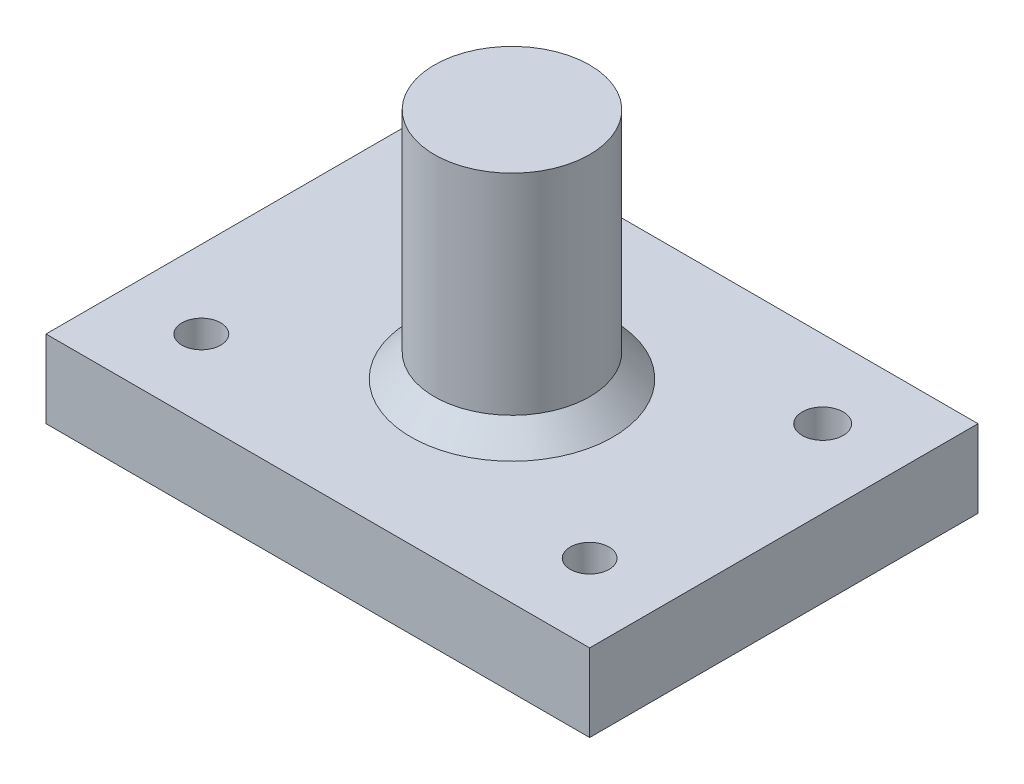
ISO-10303-21;
HEADER;
FILE_DESCRIPTION(('STEP AP214'),'2;1');
FILE_NAME('part.step','',(''),(''),'','','');
FILE_SCHEMA(('AUTOMOTIVE_DESIGN { 1 0 10303 214 1 1 1 1 }'));
ENDSEC;
DATA;
#1=APPLICATION_CONTEXT('core data for automotive mechanical design processes');
#2=APPLICATION_PROTOCOL_DEFINITION('international standard','automotive_design',2000,#1);
#3=PRODUCT_CONTEXT('',#1,'mechanical');
#4=PRODUCT('Part','Part','',(#3));
#5=PRODUCT_RELATED_PRODUCT_CATEGORY('part','',(#4));
#6=PRODUCT_DEFINITION_FORMATION('','',#4);
#7=PRODUCT_DEFINITION_CONTEXT('part definition',#1,'design');
#8=PRODUCT_DEFINITION('design','',#6,#7);
#9=PRODUCT_DEFINITION_SHAPE('','',#8);
#10=(LENGTH_UNIT() NAMED_UNIT(*) SI_UNIT(.MILLI.,.METRE.));
#11=(NAMED_UNIT(*) PLANE_ANGLE_UNIT() SI_UNIT($,.RADIAN.));
#12=(NAMED_UNIT(*) SI_UNIT($,.STERADIAN.) SOLID_ANGLE_UNIT());
#13=UNCERTAINTY_MEASURE_WITH_UNIT(LENGTH_MEASURE(1.E-05),#10,'distance_accuracy_value','');
#14=(GEOMETRIC_REPRESENTATION_CONTEXT(3) GLOBAL_UNCERTAINTY_ASSIGNED_CONTEXT((#13)) GLOBAL_UNIT_ASSIGNED_CONTEXT((#10,
#11,#12)) REPRESENTATION_CONTEXT('',''));
#15=CARTESIAN_POINT('',(0.,0.,0.));
#16=DIRECTION('',(0.,0.,1.));
#17=DIRECTION('',(1.,0.,0.));
#18=AXIS2_PLACEMENT_3D('',#15,#16,#17);
#19=CARTESIAN_POINT('',(0.,12.7,0.));
#20=DIRECTION('',(0.,-1.,0.));
#21=DIRECTION('',(0.,0.,-1.));
#22=AXIS2_PLACEMENT_3D('',#19,#20,#21);
#23=PLANE('',#22);
#24=CARTESIAN_POINT('',(0.,12.7,0.));
#25=DIRECTION('',(0.,-1.,0.));
#26=DIRECTION('',(0.,0.,-1.));
#27=AXIS2_PLACEMENT_3D('',#24,#25,#26);
#28=CIRCLE('',#27,16.5100000000001);
#29=CARTESIAN_POINT('',(0.,12.7,-16.5100000000001));
#30=VERTEX_POINT('',#29);
#31=EDGE_CURVE('E11',#30,#30,#28,.T.);
#32=ORIENTED_EDGE('',*,*,#31,.T.);
#33=EDGE_LOOP('',(#32));
#34=FACE_BOUND('',#33,.T.);
#35=DIRECTION('',(0.,0.,-1.));
#36=VECTOR('',#35,1.);
#37=CARTESIAN_POINT('',(44.45,12.7,31.75));
#38=LINE('',#37,#36);
#39=CARTESIAN_POINT('',(44.45,12.7,31.75));
#40=VERTEX_POINT('',#39);
#41=CARTESIAN_POINT('',(44.45,12.7,-31.75));
#42=VERTEX_POINT('',#41);
#43=EDGE_CURVE('E86',#40,#42,#38,.T.);
#44=ORIENTED_EDGE('',*,*,#43,.T.);
#45=DIRECTION('',(-1.,0.,0.));
#46=VECTOR('',#45,1.);
#47=CARTESIAN_POINT('',(-44.45,12.7,-31.75));
#48=LINE('',#47,#46);
#49=CARTESIAN_POINT('',(-44.45,12.7,-31.75));
#50=VERTEX_POINT('',#49);
#51=EDGE_CURVE('E81',#42,#50,#48,.T.);
#52=ORIENTED_EDGE('',*,*,#51,.T.);
#53=DIRECTION('',(0.,0.,1.));
#54=VECTOR('',#53,1.);
#55=CARTESIAN_POINT('',(-44.45,12.7,31.75));
#56=LINE('',#55,#54);
#57=CARTESIAN_POINT('',(-44.45,12.7,31.75));
#58=VERTEX_POINT('',#57);
#59=EDGE_CURVE('E84',#50,#58,#56,.T.);
#60=ORIENTED_EDGE('',*,*,#59,.T.);
#61=DIRECTION('',(1.,0.,0.));
#62=VECTOR('',#61,1.);
#63=CARTESIAN_POINT('',(-44.45,12.7,31.75));
#64=LINE('',#63,#62);
#65=EDGE_CURVE('E50',#58,#40,#64,.T.);
#66=ORIENTED_EDGE('',*,*,#65,.T.);
#67=EDGE_LOOP('',(#44,#52,#60,#66));
#68=FACE_BOUND('',#67,.T.);
#69=CARTESIAN_POINT('',(-31.75,12.7,19.05));
#70=DIRECTION('',(0.,1.,0.));
#71=DIRECTION('',(0.,0.,1.));
#72=AXIS2_PLACEMENT_3D('',#69,#70,#71);
#73=CIRCLE('',#72,3.175);
#74=CARTESIAN_POINT('',(-31.75,12.7,22.225));
#75=VERTEX_POINT('',#74);
#76=EDGE_CURVE('E104',#75,#75,#73,.T.);
#77=ORIENTED_EDGE('',*,*,#76,.F.);
#78=EDGE_LOOP('',(#77));
#79=FACE_BOUND('',#78,.T.);
#80=CARTESIAN_POINT('',(-31.75,12.7,-19.05));
#81=DIRECTION('',(0.,1.,0.));
#82=DIRECTION('',(0.,0.,1.));
#83=AXIS2_PLACEMENT_3D('',#80,#81,#82);
#84=CIRCLE('',#83,3.175);
#85=CARTESIAN_POINT('',(-31.75,12.7,-15.875));
#86=VERTEX_POINT('',#85);
#87=EDGE_CURVE('E174',#86,#86,#84,.T.);
#88=ORIENTED_EDGE('',*,*,#87,.F.);
#89=EDGE_LOOP('',(#88));
#90=FACE_BOUND('',#89,.T.);
#91=CARTESIAN_POINT('',(31.75,12.7,19.05));
#92=DIRECTION('',(0.,1.,0.));
#93=DIRECTION('',(0.,0.,1.));
#94=AXIS2_PLACEMENT_3D('',#91,#92,#93);
#95=CIRCLE('',#94,3.175);
#96=CARTESIAN_POINT('',(31.75,12.7,22.225));
#97=VERTEX_POINT('',#96);
#98=EDGE_CURVE('E169',#97,#97,#95,.T.);
#99=ORIENTED_EDGE('',*,*,#98,.F.);
#100=EDGE_LOOP('',(#99));
#101=FACE_BOUND('',#100,.T.);
#102=CARTESIAN_POINT('',(31.75,12.7,-19.05));
#103=DIRECTION('',(0.,1.,0.));
#104=DIRECTION('',(0.,0.,1.));
#105=AXIS2_PLACEMENT_3D('',#102,#103,#104);
#106=CIRCLE('',#105,3.34923459708312);
#107=CARTESIAN_POINT('',(31.75,12.7,-15.7007654029169));
#108=VERTEX_POINT('',#107);
#109=EDGE_CURVE('E160',#108,#108,#106,.T.);
#110=ORIENTED_EDGE('',*,*,#109,.F.);
#111=EDGE_LOOP('',(#110));
#112=FACE_BOUND('',#111,.T.);
#113=ADVANCED_FACE('F33',(#34,#68,#79,#90,#101,#112),#23,.F.);
#114=CARTESIAN_POINT('',(0.,0.,0.));
#115=DIRECTION('',(0.,-1.,0.));
#116=DIRECTION('',(0.,0.,-1.));
#117=AXIS2_PLACEMENT_3D('',#114,#115,#116);
#118=PLANE('',#117);
#119=CARTESIAN_POINT('',(31.75,0.,19.05));
#120=DIRECTION('',(0.,1.,0.));
#121=DIRECTION('',(0.,0.,1.));
#122=AXIS2_PLACEMENT_3D('',#119,#120,#121);
#123=CIRCLE('',#122,3.175);
#124=CARTESIAN_POINT('',(31.75,0.,22.225));
#125=VERTEX_POINT('',#124);
#126=EDGE_CURVE('E164',#125,#125,#123,.T.);
#127=ORIENTED_EDGE('',*,*,#126,.T.);
#128=EDGE_LOOP('',(#127));
#129=FACE_BOUND('',#128,.T.);
#130=CARTESIAN_POINT('',(-31.75,0.,19.05));
#131=DIRECTION('',(0.,1.,0.));
#132=DIRECTION('',(0.,0.,1.));
#133=AXIS2_PLACEMENT_3D('',#130,#131,#132);
#134=CIRCLE('',#133,3.175);
#135=CARTESIAN_POINT('',(-31.75,0.,22.225));
#136=VERTEX_POINT('',#135);
#137=EDGE_CURVE('E177',#136,#136,#134,.T.);
#138=ORIENTED_EDGE('',*,*,#137,.T.);
#139=EDGE_LOOP('',(#138));
#140=FACE_BOUND('',#139,.T.);
#141=DIRECTION('',(0.,0.,-1.));
#142=VECTOR('',#141,1.);
#143=CARTESIAN_POINT('',(44.45,0.,31.75));
#144=LINE('',#143,#142);
#145=CARTESIAN_POINT('',(44.45,0.,31.75));
#146=VERTEX_POINT('',#145);
#147=CARTESIAN_POINT('',(44.45,0.,-31.75));
#148=VERTEX_POINT('',#147);
#149=EDGE_CURVE('E101',#146,#148,#144,.T.);
#150=ORIENTED_EDGE('',*,*,#149,.F.);
#151=DIRECTION('',(1.,0.,0.));
#152=VECTOR('',#151,1.);
#153=CARTESIAN_POINT('',(-44.45,0.,31.75));
#154=LINE('',#153,#152);
#155=CARTESIAN_POINT('',(-44.45,0.,31.75));
#156=VERTEX_POINT('',#155);
#157=EDGE_CURVE('E73',#156,#146,#154,.T.);
#158=ORIENTED_EDGE('',*,*,#157,.F.);
#159=DIRECTION('',(0.,0.,1.));
#160=VECTOR('',#159,1.);
#161=CARTESIAN_POINT('',(-44.45,0.,31.75));
#162=LINE('',#161,#160);
#163=CARTESIAN_POINT('',(-44.45,0.,-31.75));
#164=VERTEX_POINT('',#163);
#165=EDGE_CURVE('E67',#164,#156,#162,.T.);
#166=ORIENTED_EDGE('',*,*,#165,.F.);
#167=DIRECTION('',(-1.,0.,0.));
#168=VECTOR('',#167,1.);
#169=CARTESIAN_POINT('',(-44.45,0.,-31.75));
#170=LINE('',#169,#168);
#171=EDGE_CURVE('E91',#148,#164,#170,.T.);
#172=ORIENTED_EDGE('',*,*,#171,.F.);
#173=EDGE_LOOP('',(#150,#158,#166,#172));
#174=FACE_BOUND('',#173,.T.);
#175=CARTESIAN_POINT('',(-31.75,0.,-19.05));
#176=DIRECTION('',(0.,1.,0.));
#177=DIRECTION('',(0.,0.,1.));
#178=AXIS2_PLACEMENT_3D('',#175,#176,#177);
#179=CIRCLE('',#178,3.175);
#180=CARTESIAN_POINT('',(-31.75,0.,-15.875));
#181=VERTEX_POINT('',#180);
#182=EDGE_CURVE('E155',#181,#181,#179,.T.);
#183=ORIENTED_EDGE('',*,*,#182,.T.);
#184=EDGE_LOOP('',(#183));
#185=FACE_BOUND('',#184,.T.);
#186=CARTESIAN_POINT('',(31.75,0.,-19.05));
#187=DIRECTION('',(0.,1.,0.));
#188=DIRECTION('',(0.,0.,1.));
#189=AXIS2_PLACEMENT_3D('',#186,#187,#188);
#190=CIRCLE('',#189,3.34923459708312);
#191=CARTESIAN_POINT('',(31.75,0.,-15.7007654029169));
#192=VERTEX_POINT('',#191);
#193=EDGE_CURVE('E158',#192,#192,#190,.T.);
#194=ORIENTED_EDGE('',*,*,#193,.T.);
#195=EDGE_LOOP('',(#194));
#196=FACE_BOUND('',#195,.T.);
#197=ADVANCED_FACE('F126',(#129,#140,#174,#185,#196),#118,.T.);
#198=CARTESIAN_POINT('',(44.45,12.7,31.75));
#199=DIRECTION('',(-1.,0.,0.));
#200=DIRECTION('',(0.,0.,1.));
#201=AXIS2_PLACEMENT_3D('',#198,#199,#200);
#202=PLANE('',#201);
#203=ORIENTED_EDGE('',*,*,#149,.T.);
#204=DIRECTION('',(0.,-1.,0.));
#205=VECTOR('',#204,1.);
#206=CARTESIAN_POINT('',(44.45,12.7,-31.75));
#207=LINE('',#206,#205);
#208=EDGE_CURVE('E92',#42,#148,#207,.T.);
#209=ORIENTED_EDGE('',*,*,#208,.F.);
#210=ORIENTED_EDGE('',*,*,#43,.F.);
#211=DIRECTION('',(0.,-1.,0.));
#212=VECTOR('',#211,1.);
#213=CARTESIAN_POINT('',(44.45,12.7,31.75));
#214=LINE('',#213,#212);
#215=EDGE_CURVE('E97',#40,#146,#214,.T.);
#216=ORIENTED_EDGE('',*,*,#215,.T.);
#217=EDGE_LOOP('',(#203,#209,#210,#216));
#218=FACE_BOUND('',#217,.T.);
#219=ADVANCED_FACE('F132',(#218),#202,.F.);
#220=CARTESIAN_POINT('',(-44.45,12.7,-31.75));
#221=DIRECTION('',(0.,0.,1.));
#222=DIRECTION('',(1.,0.,0.));
#223=AXIS2_PLACEMENT_3D('',#220,#221,#222);
#224=PLANE('',#223);
#225=ORIENTED_EDGE('',*,*,#171,.T.);
#226=DIRECTION('',(0.,-1.,0.));
#227=VECTOR('',#226,1.);
#228=CARTESIAN_POINT('',(-44.45,12.7,-31.75));
#229=LINE('',#228,#227);
#230=EDGE_CURVE('E89',#50,#164,#229,.T.);
#231=ORIENTED_EDGE('',*,*,#230,.F.);
#232=ORIENTED_EDGE('',*,*,#51,.F.);
#233=ORIENTED_EDGE('',*,*,#208,.T.);
#234=EDGE_LOOP('',(#225,#231,#232,#233));
#235=FACE_BOUND('',#234,.T.);
#236=ADVANCED_FACE('F90',(#235),#224,.F.);
#237=CARTESIAN_POINT('',(-44.45,12.7,31.75));
#238=DIRECTION('',(1.,0.,0.));
#239=DIRECTION('',(0.,0.,-1.));
#240=AXIS2_PLACEMENT_3D('',#237,#238,#239);
#241=PLANE('',#240);
#242=ORIENTED_EDGE('',*,*,#165,.T.);
#243=DIRECTION('',(0.,-1.,0.));
#244=VECTOR('',#243,1.);
#245=CARTESIAN_POINT('',(-44.45,12.7,31.75));
#246=LINE('',#245,#244);
#247=EDGE_CURVE('E93',#58,#156,#246,.T.);
#248=ORIENTED_EDGE('',*,*,#247,.F.);
#249=ORIENTED_EDGE('',*,*,#59,.F.);
#250=ORIENTED_EDGE('',*,*,#230,.T.);
#251=EDGE_LOOP('',(#242,#248,#249,#250));
#252=FACE_BOUND('',#251,.T.);
#253=ADVANCED_FACE('F95',(#252),#241,.F.);
#254=CARTESIAN_POINT('',(-44.45,12.7,31.75));
#255=DIRECTION('',(0.,0.,-1.));
#256=DIRECTION('',(-1.,0.,0.));
#257=AXIS2_PLACEMENT_3D('',#254,#255,#256);
#258=PLANE('',#257);
#259=ORIENTED_EDGE('',*,*,#157,.T.);
#260=ORIENTED_EDGE('',*,*,#215,.F.);
#261=ORIENTED_EDGE('',*,*,#65,.F.);
#262=ORIENTED_EDGE('',*,*,#247,.T.);
#263=EDGE_LOOP('',(#259,#260,#261,#262));
#264=FACE_BOUND('',#263,.T.);
#265=ADVANCED_FACE('F139',(#264),#258,.F.);
#266=CARTESIAN_POINT('',(-31.75,12.7,19.05));
#267=DIRECTION('',(0.,-1.,0.));
#268=DIRECTION('',(0.,0.,-1.));
#269=AXIS2_PLACEMENT_3D('',#266,#267,#268);
#270=CYLINDRICAL_SURFACE('',#269,3.175);
#271=ORIENTED_EDGE('',*,*,#76,.T.);
#272=EDGE_LOOP('',(#271));
#273=FACE_BOUND('',#272,.T.);
#274=ORIENTED_EDGE('',*,*,#137,.F.);
#275=EDGE_LOOP('',(#274));
#276=FACE_BOUND('',#275,.T.);
#277=ADVANCED_FACE('F136',(#273,#276),#270,.F.);
#278=CARTESIAN_POINT('',(-31.75,12.7,-19.05));
#279=DIRECTION('',(0.,-1.,0.));
#280=DIRECTION('',(0.,0.,-1.));
#281=AXIS2_PLACEMENT_3D('',#278,#279,#280);
#282=CYLINDRICAL_SURFACE('',#281,3.175);
#283=ORIENTED_EDGE('',*,*,#87,.T.);
#284=EDGE_LOOP('',(#283));
#285=FACE_BOUND('',#284,.T.);
#286=ORIENTED_EDGE('',*,*,#182,.F.);
#287=EDGE_LOOP('',(#286));
#288=FACE_BOUND('',#287,.T.);
#289=ADVANCED_FACE('F186',(#285,#288),#282,.F.);
#290=CARTESIAN_POINT('',(31.75,12.7,19.05));
#291=DIRECTION('',(0.,-1.,0.));
#292=DIRECTION('',(0.,0.,-1.));
#293=AXIS2_PLACEMENT_3D('',#290,#291,#292);
#294=CYLINDRICAL_SURFACE('',#293,3.175);
#295=ORIENTED_EDGE('',*,*,#98,.T.);
#296=EDGE_LOOP('',(#295));
#297=FACE_BOUND('',#296,.T.);
#298=ORIENTED_EDGE('',*,*,#126,.F.);
#299=EDGE_LOOP('',(#298));
#300=FACE_BOUND('',#299,.T.);
#301=ADVANCED_FACE('F191',(#297,#300),#294,.F.);
#302=CARTESIAN_POINT('',(31.75,12.7,-19.05));
#303=DIRECTION('',(0.,-1.,0.));
#304=DIRECTION('',(0.,0.,-1.));
#305=AXIS2_PLACEMENT_3D('',#302,#303,#304);
#306=CYLINDRICAL_SURFACE('',#305,3.34923459708312);
#307=ORIENTED_EDGE('',*,*,#109,.T.);
#308=EDGE_LOOP('',(#307));
#309=FACE_BOUND('',#308,.T.);
#310=ORIENTED_EDGE('',*,*,#193,.F.);
#311=EDGE_LOOP('',(#310));
#312=FACE_BOUND('',#311,.T.);
#313=ADVANCED_FACE('F201',(#309,#312),#306,.F.);
#314=CARTESIAN_POINT('',(0.,50.8,0.));
#315=DIRECTION('',(0.,-1.,0.));
#316=DIRECTION('',(0.,0.,-1.));
#317=AXIS2_PLACEMENT_3D('',#314,#315,#316);
#318=CYLINDRICAL_SURFACE('',#317,12.7);
#319=CARTESIAN_POINT('',(0.,16.5100000000001,0.));
#320=DIRECTION('',(0.,-1.,0.));
#321=DIRECTION('',(0.,0.,-1.));
#322=AXIS2_PLACEMENT_3D('',#319,#320,#321);
#323=CIRCLE('',#322,12.7);
#324=CARTESIAN_POINT('',(0.,16.5100000000001,-12.7));
#325=VERTEX_POINT('',#324);
#326=EDGE_CURVE('E42',#325,#325,#323,.F.);
#327=CARTESIAN_POINT('',(0.,50.8,0.));
#328=DIRECTION('',(0.,1.,0.));
#329=DIRECTION('',(0.,0.,1.));
#330=AXIS2_PLACEMENT_3D('',#327,#328,#329);
#331=CIRCLE('',#330,12.7);
#332=CARTESIAN_POINT('',(0.,50.8,-12.7));
#333=VERTEX_POINT('',#332);
#334=EDGE_CURVE('E161',#333,#333,#331,.T.);
#335=CARTESIAN_POINT('',(0.,16.5100000000001,-12.7));
#336=CARTESIAN_POINT('',(0.,16.8671875000001,-12.7));
#337=CARTESIAN_POINT('',(0.,17.2243750000001,-12.7));
#338=CARTESIAN_POINT('',(0.,17.9387500000001,-12.7));
#339=CARTESIAN_POINT('',(0.,18.2959375000001,-12.7));
#340=CARTESIAN_POINT('',(0.,19.0103125000001,-12.7));
#341=CARTESIAN_POINT('',(0.,19.3675000000001,-12.7));
#342=CARTESIAN_POINT('',(0.,20.0818750000001,-12.7));
#343=CARTESIAN_POINT('',(0.,20.4390625000001,-12.7));
#344=CARTESIAN_POINT('',(0.,21.1534375000001,-12.7));
#345=CARTESIAN_POINT('',(0.,21.5106250000001,-12.7));
#346=CARTESIAN_POINT('',(0.,22.2250000000001,-12.7));
#347=CARTESIAN_POINT('',(0.,22.5821875000001,-12.7));
#348=CARTESIAN_POINT('',(0.,23.2965625000001,-12.7));
#349=CARTESIAN_POINT('',(0.,23.6537500000001,-12.7));
#350=CARTESIAN_POINT('',(0.,24.3681250000001,-12.7));
#351=CARTESIAN_POINT('',(0.,24.7253125000001,-12.7));
#352=CARTESIAN_POINT('',(0.,25.4396875000001,-12.7));
#353=CARTESIAN_POINT('',(0.,25.7968750000001,-12.7));
#354=CARTESIAN_POINT('',(0.,26.5112500000001,-12.7));
#355=CARTESIAN_POINT('',(0.,26.8684375000001,-12.7));
#356=CARTESIAN_POINT('',(0.,27.5828125000001,-12.7));
#357=CARTESIAN_POINT('',(0.,27.9400000000001,-12.7));
#358=CARTESIAN_POINT('',(0.,28.6543750000001,-12.7));
#359=CARTESIAN_POINT('',(0.,29.0115625000001,-12.7));
#360=CARTESIAN_POINT('',(0.,29.7259375000001,-12.7));
#361=CARTESIAN_POINT('',(0.,30.0831250000001,-12.7));
#362=CARTESIAN_POINT('',(0.,30.7975,-12.7));
#363=CARTESIAN_POINT('',(0.,31.1546875,-12.7));
#364=CARTESIAN_POINT('',(0.,31.8690625,-12.7));
#365=CARTESIAN_POINT('',(0.,32.2262500000001,-12.7));
#366=CARTESIAN_POINT('',(0.,32.940625,-12.7));
#367=CARTESIAN_POINT('',(0.,33.2978125,-12.7));
#368=CARTESIAN_POINT('',(0.,34.0121875,-12.7));
#369=CARTESIAN_POINT('',(0.,34.369375,-12.7));
#370=CARTESIAN_POINT('',(0.,35.08375,-12.7));
#371=CARTESIAN_POINT('',(0.,35.4409375,-12.7));
#372=CARTESIAN_POINT('',(0.,36.1553125,-12.7));
#373=CARTESIAN_POINT('',(0.,36.5125,-12.7));
#374=CARTESIAN_POINT('',(0.,37.226875,-12.7));
#375=CARTESIAN_POINT('',(0.,37.5840625,-12.7));
#376=CARTESIAN_POINT('',(0.,38.2984375,-12.7));
#377=CARTESIAN_POINT('',(0.,38.655625,-12.7));
#378=CARTESIAN_POINT('',(0.,39.37,-12.7));
#379=CARTESIAN_POINT('',(0.,39.7271875,-12.7));
#380=CARTESIAN_POINT('',(0.,40.4415625,-12.7));
#381=CARTESIAN_POINT('',(0.,40.79875,-12.7));
#382=CARTESIAN_POINT('',(0.,41.513125,-12.7));
#383=CARTESIAN_POINT('',(0.,41.8703125,-12.7));
#384=CARTESIAN_POINT('',(0.,42.5846875,-12.7));
#385=CARTESIAN_POINT('',(0.,42.941875,-12.7));
#386=CARTESIAN_POINT('',(0.,43.65625,-12.7));
#387=CARTESIAN_POINT('',(0.,44.0134375,-12.7));
#388=CARTESIAN_POINT('',(0.,44.7278125,-12.7));
#389=CARTESIAN_POINT('',(0.,45.085,-12.7));
#390=CARTESIAN_POINT('',(0.,45.799375,-12.7));
#391=CARTESIAN_POINT('',(0.,46.1565625,-12.7));
#392=CARTESIAN_POINT('',(0.,46.8709375,-12.7));
#393=CARTESIAN_POINT('',(0.,47.228125,-12.7));
#394=CARTESIAN_POINT('',(0.,47.9425,-12.7));
#395=CARTESIAN_POINT('',(0.,48.2996875,-12.7));
#396=CARTESIAN_POINT('',(0.,49.0140625,-12.7));
#397=CARTESIAN_POINT('',(0.,49.37125,-12.7));
#398=CARTESIAN_POINT('',(0.,50.085625,-12.7));
#399=CARTESIAN_POINT('',(0.,50.4428125,-12.7));
#400=CARTESIAN_POINT('',(0.,50.8,-12.7));
#401=B_SPLINE_CURVE_WITH_KNOTS('',3,(#335,#336,#337,#338,#339,#340,#341,#342,#343,#344,#345,
#346,#347,#348,#349,#350,#351,#352,#353,#354,#355,#356,#357,#358,#359,#360,#361,#362,#363,#364,
#365,#366,#367,#368,#369,#370,#371,#372,#373,#374,#375,#376,#377,#378,#379,#380,#381,#382,#383,
#384,#385,#386,#387,#388,#389,#390,#391,#392,#393,#394,#395,#396,#397,#398,#399,#400),
.UNSPECIFIED.,.F.,.F.,(4,2,2,2,2,2,2,2,2,2,2,2,2,2,2,2,2,2,2,2,2,2,2,2,2,2,2,2,2,2,2,2,4),(0.,
1.0715625,2.143125,3.21468749999999,4.28624999999998,5.35781249999998,6.42937499999998,
7.50093749999998,8.57249999999997,9.64406249999997,10.715625,11.7871875,12.85875,13.9303125,
15.001875,16.0734375,17.145,18.2165624999999,19.2881249999999,20.3596874999999,21.4312499999999,
22.5028124999999,23.5743749999999,24.6459374999999,25.7174999999999,26.7890624999999,
27.8606249999999,28.9321874999999,30.0037499999999,31.0753124999999,32.1468749999999,
33.2184374999999,34.2899999999999),.UNSPECIFIED.);
#402=EDGE_CURVE('BSEAM113',#325,#333,#401,.T.);
#403=ORIENTED_EDGE('',*,*,#326,.T.);
#404=ORIENTED_EDGE('',*,*,#334,.F.);
#405=ORIENTED_EDGE('',*,*,#402,.T.);
#406=ORIENTED_EDGE('',*,*,#402,.F.);
#407=EDGE_LOOP('',(#403,#405,#404,#406));
#408=FACE_BOUND('',#407,.T.);
#409=ADVANCED_FACE('F113',(#408),#318,.T.);
#410=CARTESIAN_POINT('',(0.,50.8,0.));
#411=DIRECTION('',(0.,1.,0.));
#412=DIRECTION('',(0.,0.,1.));
#413=AXIS2_PLACEMENT_3D('',#410,#411,#412);
#414=PLANE('',#413);
#415=ORIENTED_EDGE('',*,*,#334,.T.);
#416=EDGE_LOOP('',(#415));
#417=FACE_BOUND('',#416,.T.);
#418=ADVANCED_FACE('F117',(#417),#414,.T.);
#419=CARTESIAN_POINT('',(0.,16.5100000000001,0.));
#420=DIRECTION('',(0.,-1.,0.));
#421=DIRECTION('',(0.,0.,-1.));
#422=AXIS2_PLACEMENT_3D('',#419,#420,#421);
#423=CONICAL_SURFACE('',#422,12.7,0.785398163397445);
#424=CARTESIAN_POINT('',(0.,12.7,-16.5100000000001));
#425=CARTESIAN_POINT('',(0.,12.7396875,-16.4703125000001));
#426=CARTESIAN_POINT('',(0.,12.779375,-16.4306250000001));
#427=CARTESIAN_POINT('',(0.,12.85875,-16.3512500000001));
#428=CARTESIAN_POINT('',(0.,12.8984375,-16.3115625000001));
#429=CARTESIAN_POINT('',(0.,12.9778125,-16.2321875000001));
#430=CARTESIAN_POINT('',(0.,13.0175,-16.1925000000001));
#431=CARTESIAN_POINT('',(0.,13.096875,-16.113125));
#432=CARTESIAN_POINT('',(0.,13.1365625,-16.0734375));
#433=CARTESIAN_POINT('',(0.,13.2159375,-15.9940625));
#434=CARTESIAN_POINT('',(0.,13.255625,-15.954375));
#435=CARTESIAN_POINT('',(0.,13.335,-15.875));
#436=CARTESIAN_POINT('',(0.,13.3746875,-15.8353125));
#437=CARTESIAN_POINT('',(0.,13.4540625,-15.7559375));
#438=CARTESIAN_POINT('',(0.,13.49375,-15.71625));
#439=CARTESIAN_POINT('',(0.,13.573125,-15.636875));
#440=CARTESIAN_POINT('',(0.,13.6128125,-15.5971875));
#441=CARTESIAN_POINT('',(0.,13.6921875,-15.5178125));
#442=CARTESIAN_POINT('',(0.,13.731875,-15.478125));
#443=CARTESIAN_POINT('',(0.,13.81125,-15.39875));
#444=CARTESIAN_POINT('',(0.,13.8509375,-15.3590625));
#445=CARTESIAN_POINT('',(0.,13.9303125,-15.2796875));
#446=CARTESIAN_POINT('',(0.,13.97,-15.24));
#447=CARTESIAN_POINT('',(0.,14.049375,-15.160625));
#448=CARTESIAN_POINT('',(0.,14.0890625,-15.1209375));
#449=CARTESIAN_POINT('',(0.,14.1684375,-15.0415625));
#450=CARTESIAN_POINT('',(0.,14.208125,-15.001875));
#451=CARTESIAN_POINT('',(0.,14.2875,-14.9225));
#452=CARTESIAN_POINT('',(0.,14.3271875,-14.8828125));
#453=CARTESIAN_POINT('',(0.,14.4065625,-14.8034375));
#454=CARTESIAN_POINT('',(0.,14.44625,-14.76375));
#455=CARTESIAN_POINT('',(0.,14.525625,-14.684375));
#456=CARTESIAN_POINT('',(0.,14.5653125,-14.6446875));
#457=CARTESIAN_POINT('',(0.,14.6446875,-14.5653125));
#458=CARTESIAN_POINT('',(0.,14.684375,-14.525625));
#459=CARTESIAN_POINT('',(0.,14.76375,-14.44625));
#460=CARTESIAN_POINT('',(0.,14.8034375,-14.4065625));
#461=CARTESIAN_POINT('',(0.,14.8828125000001,-14.3271875));
#462=CARTESIAN_POINT('',(0.,14.9225000000001,-14.2875));
#463=CARTESIAN_POINT('',(0.,15.0018750000001,-14.208125));
#464=CARTESIAN_POINT('',(0.,15.0415625000001,-14.1684375));
#465=CARTESIAN_POINT('',(0.,15.1209375000001,-14.0890625));
#466=CARTESIAN_POINT('',(0.,15.1606250000001,-14.049375));
#467=CARTESIAN_POINT('',(0.,15.2400000000001,-13.97));
#468=CARTESIAN_POINT('',(0.,15.2796875000001,-13.9303125));
#469=CARTESIAN_POINT('',(0.,15.3590625000001,-13.8509375));
#470=CARTESIAN_POINT('',(0.,15.3987500000001,-13.81125));
#471=CARTESIAN_POINT('',(0.,15.4781250000001,-13.731875));
#472=CARTESIAN_POINT('',(0.,15.5178125000001,-13.6921875));
#473=CARTESIAN_POINT('',(0.,15.5971875000001,-13.6128125));
#474=CARTESIAN_POINT('',(0.,15.6368750000001,-13.573125));
#475=CARTESIAN_POINT('',(0.,15.7162500000001,-13.49375));
#476=CARTESIAN_POINT('',(0.,15.7559375000001,-13.4540625));
#477=CARTESIAN_POINT('',(0.,15.8353125000001,-13.3746875));
#478=CARTESIAN_POINT('',(0.,15.8750000000001,-13.335));
#479=CARTESIAN_POINT('',(0.,15.9543750000001,-13.255625));
#480=CARTESIAN_POINT('',(0.,15.9940625000001,-13.2159375));
#481=CARTESIAN_POINT('',(0.,16.0734375000001,-13.1365625));
#482=CARTESIAN_POINT('',(0.,16.1131250000001,-13.096875));
#483=CARTESIAN_POINT('',(0.,16.1925000000001,-13.0175));
#484=CARTESIAN_POINT('',(0.,16.2321875000001,-12.9778125));
#485=CARTESIAN_POINT('',(0.,16.3115625000001,-12.8984375));
#486=CARTESIAN_POINT('',(0.,16.3512500000001,-12.85875));
#487=CARTESIAN_POINT('',(0.,16.4306250000001,-12.779375));
#488=CARTESIAN_POINT('',(0.,16.4703125000001,-12.7396875));
#489=CARTESIAN_POINT('',(0.,16.5100000000001,-12.7));
#490=B_SPLINE_CURVE_WITH_KNOTS('',3,(#424,#425,#426,#427,#428,#429,#430,#431,#432,#433,#434,
#435,#436,#437,#438,#439,#440,#441,#442,#443,#444,#445,#446,#447,#448,#449,#450,#451,#452,#453,
#454,#455,#456,#457,#458,#459,#460,#461,#462,#463,#464,#465,#466,#467,#468,#469,#470,#471,#472,
#473,#474,#475,#476,#477,#478,#479,#480,#481,#482,#483,#484,#485,#486,#487,#488,#489),
.UNSPECIFIED.,.F.,.F.,(4,2,2,2,2,2,2,2,2,2,2,2,2,2,2,2,2,2,2,2,2,2,2,2,2,2,2,2,2,2,2,2,4),(0.,
0.168379802270051,0.336759604540101,0.50513940681015,0.673519209080199,0.84189901135025,
1.0102788136203,1.17865861589035,1.3470384181604,1.51541822043045,1.6837980227005,
1.85217782497055,2.0205576272406,2.18893742951065,2.3573172317807,2.52569703405075,
2.6940768363208,2.86245663859085,3.0308364408609,3.19921624313095,3.367596045401,
3.53597584767105,3.7043556499411,3.87273545221115,4.0411152544812,4.20949505675125,
4.3778748590213,4.54625466129135,4.7146344635614,4.88301426583145,5.0513940681015,
5.21977387037155,5.3881536726416),.UNSPECIFIED.);
#491=EDGE_CURVE('BSEAM35',#30,#325,#490,.T.);
#492=ORIENTED_EDGE('',*,*,#31,.F.);
#493=ORIENTED_EDGE('',*,*,#326,.F.);
#494=ORIENTED_EDGE('',*,*,#491,.T.);
#495=ORIENTED_EDGE('',*,*,#491,.F.);
#496=EDGE_LOOP('',(#492,#494,#493,#495));
#497=FACE_BOUND('',#496,.T.);
#498=ADVANCED_FACE('F35',(#497),#423,.T.);
#499=CLOSED_SHELL('',(#113,#197,#219,#236,#253,#265,#277,#289,#301,#313,#409,#418,#498));
#500=MANIFOLD_SOLID_BREP('B2',#499);
#501=ADVANCED_BREP_SHAPE_REPRESENTATION('',(#18,#500),#14);
#502=SHAPE_DEFINITION_REPRESENTATION(#9,#501);
ENDSEC;
END-ISO-10303-21;
